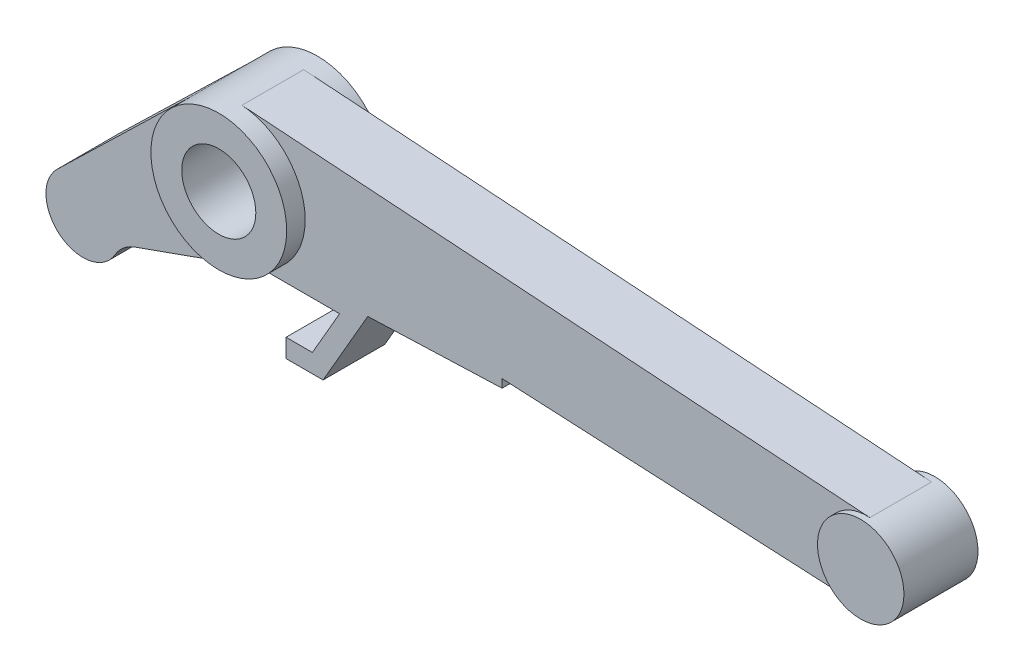
ISO-10303-21;
HEADER;
FILE_DESCRIPTION(('STEP AP214'),'2;1');
FILE_NAME('part.step','',(''),(''),'','','');
FILE_SCHEMA(('AUTOMOTIVE_DESIGN { 1 0 10303 214 1 1 1 1 }'));
ENDSEC;
DATA;
#1=APPLICATION_CONTEXT('core data for automotive mechanical design processes');
#2=APPLICATION_PROTOCOL_DEFINITION('international standard','automotive_design',2000,#1);
#3=PRODUCT_CONTEXT('',#1,'mechanical');
#4=PRODUCT('Part','Part','',(#3));
#5=PRODUCT_RELATED_PRODUCT_CATEGORY('part','',(#4));
#6=PRODUCT_DEFINITION_FORMATION('','',#4);
#7=PRODUCT_DEFINITION_CONTEXT('part definition',#1,'design');
#8=PRODUCT_DEFINITION('design','',#6,#7);
#9=PRODUCT_DEFINITION_SHAPE('','',#8);
#10=(LENGTH_UNIT() NAMED_UNIT(*) SI_UNIT(.MILLI.,.METRE.));
#11=(NAMED_UNIT(*) PLANE_ANGLE_UNIT() SI_UNIT($,.RADIAN.));
#12=(NAMED_UNIT(*) SI_UNIT($,.STERADIAN.) SOLID_ANGLE_UNIT());
#13=UNCERTAINTY_MEASURE_WITH_UNIT(LENGTH_MEASURE(1.E-05),#10,'distance_accuracy_value','');
#14=(GEOMETRIC_REPRESENTATION_CONTEXT(3) GLOBAL_UNCERTAINTY_ASSIGNED_CONTEXT((#13)) GLOBAL_UNIT_ASSIGNED_CONTEXT((#10,
#11,#12)) REPRESENTATION_CONTEXT('',''));
#15=CARTESIAN_POINT('',(0.,0.,0.));
#16=DIRECTION('',(0.,0.,1.));
#17=DIRECTION('',(1.,0.,0.));
#18=AXIS2_PLACEMENT_3D('',#15,#16,#17);
#19=CARTESIAN_POINT('',(0.,0.,8.));
#20=DIRECTION('',(0.,0.,1.));
#21=DIRECTION('',(1.,0.,0.));
#22=AXIS2_PLACEMENT_3D('',#19,#20,#21);
#23=PLANE('',#22);
#24=CARTESIAN_POINT('',(0.,0.,8.));
#25=DIRECTION('',(0.,0.,1.));
#26=DIRECTION('',(1.,0.,0.));
#27=AXIS2_PLACEMENT_3D('',#24,#25,#26);
#28=CIRCLE('',#27,11.);
#29=CARTESIAN_POINT('',(11.,0.,8.));
#30=VERTEX_POINT('',#29);
#31=EDGE_CURVE('E11',#30,#30,#28,.T.);
#32=ORIENTED_EDGE('',*,*,#31,.T.);
#33=EDGE_LOOP('',(#32));
#34=FACE_BOUND('',#33,.T.);
#35=CARTESIAN_POINT('',(0.,0.,8.));
#36=DIRECTION('',(0.,0.,1.));
#37=DIRECTION('',(1.,0.,0.));
#38=AXIS2_PLACEMENT_3D('',#35,#36,#37);
#39=CIRCLE('',#38,6.);
#40=CARTESIAN_POINT('',(6.,0.,8.));
#41=VERTEX_POINT('',#40);
#42=EDGE_CURVE('E256',#41,#41,#39,.T.);
#43=ORIENTED_EDGE('',*,*,#42,.F.);
#44=EDGE_LOOP('',(#43));
#45=FACE_BOUND('',#44,.T.);
#46=ADVANCED_FACE('F40',(#34,#45),#23,.T.);
#47=CARTESIAN_POINT('',(0.,0.,-8.));
#48=DIRECTION('',(0.,0.,1.));
#49=DIRECTION('',(1.,0.,0.));
#50=AXIS2_PLACEMENT_3D('',#47,#48,#49);
#51=PLANE('',#50);
#52=CARTESIAN_POINT('',(0.,0.,-8.));
#53=DIRECTION('',(0.,0.,1.));
#54=DIRECTION('',(1.,0.,0.));
#55=AXIS2_PLACEMENT_3D('',#52,#53,#54);
#56=CIRCLE('',#55,11.);
#57=CARTESIAN_POINT('',(11.,0.,-8.));
#58=VERTEX_POINT('',#57);
#59=EDGE_CURVE('E44',#58,#58,#56,.T.);
#60=ORIENTED_EDGE('',*,*,#59,.F.);
#61=EDGE_LOOP('',(#60));
#62=FACE_BOUND('',#61,.T.);
#63=CARTESIAN_POINT('',(0.,0.,-8.));
#64=DIRECTION('',(0.,0.,1.));
#65=DIRECTION('',(1.,0.,0.));
#66=AXIS2_PLACEMENT_3D('',#63,#64,#65);
#67=CIRCLE('',#66,6.);
#68=CARTESIAN_POINT('',(6.,0.,-8.));
#69=VERTEX_POINT('',#68);
#70=EDGE_CURVE('E259',#69,#69,#67,.T.);
#71=ORIENTED_EDGE('',*,*,#70,.T.);
#72=EDGE_LOOP('',(#71));
#73=FACE_BOUND('',#72,.T.);
#74=ADVANCED_FACE('F263',(#62,#73),#51,.F.);
#75=CARTESIAN_POINT('',(0.,0.,8.));
#76=DIRECTION('',(0.,0.,-1.));
#77=DIRECTION('',(-1.,0.,0.));
#78=AXIS2_PLACEMENT_3D('',#75,#76,#77);
#79=CYLINDRICAL_SURFACE('',#78,11.);
#80=CARTESIAN_POINT('',(0.,0.,5.));
#81=DIRECTION('',(0.,0.,1.));
#82=DIRECTION('',(1.,0.,0.));
#83=AXIS2_PLACEMENT_3D('',#80,#81,#82);
#84=CIRCLE('',#83,11.);
#85=CARTESIAN_POINT('',(3.69577035609868,-10.3605637624109,5.));
#86=VERTEX_POINT('',#85);
#87=CARTESIAN_POINT('',(0.754140733364815,10.974118267737,5.));
#88=VERTEX_POINT('',#87);
#89=EDGE_CURVE('E59',#86,#88,#84,.T.);
#90=ORIENTED_EDGE('',*,*,#89,.T.);
#91=DIRECTION('',(0.,0.,-1.));
#92=VECTOR('',#91,1.);
#93=CARTESIAN_POINT('',(0.754140733364814,10.974118267737,5.));
#94=LINE('',#93,#92);
#95=CARTESIAN_POINT('',(0.754140733364814,10.974118267737,-5.));
#96=VERTEX_POINT('',#95);
#97=EDGE_CURVE('E251',#88,#96,#94,.T.);
#98=ORIENTED_EDGE('',*,*,#97,.T.);
#99=CARTESIAN_POINT('',(0.,0.,-5.));
#100=DIRECTION('',(0.,0.,1.));
#101=DIRECTION('',(1.,0.,0.));
#102=AXIS2_PLACEMENT_3D('',#99,#100,#101);
#103=CIRCLE('',#102,11.);
#104=CARTESIAN_POINT('',(3.69577035609868,-10.3605637624109,-5.));
#105=VERTEX_POINT('',#104);
#106=EDGE_CURVE('E176',#105,#96,#103,.T.);
#107=ORIENTED_EDGE('',*,*,#106,.F.);
#108=CARTESIAN_POINT('',(-7.6555888425029,7.89885811206563,-5.));
#109=VERTEX_POINT('',#108);
#110=EDGE_CURVE('E254',#109,#105,#103,.T.);
#111=ORIENTED_EDGE('',*,*,#110,.F.);
#112=DIRECTION('',(0.,0.,-1.));
#113=VECTOR('',#112,1.);
#114=CARTESIAN_POINT('',(-7.6555888425029,7.89885811206563,5.));
#115=LINE('',#114,#113);
#116=CARTESIAN_POINT('',(-7.6555888425029,7.89885811206563,5.));
#117=VERTEX_POINT('',#116);
#118=EDGE_CURVE('E248',#117,#109,#115,.T.);
#119=ORIENTED_EDGE('',*,*,#118,.F.);
#120=EDGE_CURVE('E55',#117,#86,#84,.T.);
#121=ORIENTED_EDGE('',*,*,#120,.T.);
#122=EDGE_LOOP('',(#90,#98,#107,#111,#119,#121));
#123=FACE_BOUND('',#122,.T.);
#124=ORIENTED_EDGE('',*,*,#31,.F.);
#125=EDGE_LOOP('',(#124));
#126=FACE_BOUND('',#125,.T.);
#127=ORIENTED_EDGE('',*,*,#59,.T.);
#128=EDGE_LOOP('',(#127));
#129=FACE_BOUND('',#128,.T.);
#130=ADVANCED_FACE('F42',(#123,#126,#129),#79,.T.);
#131=CARTESIAN_POINT('',(0.,0.,8.));
#132=DIRECTION('',(0.,0.,-1.));
#133=DIRECTION('',(-1.,0.,0.));
#134=AXIS2_PLACEMENT_3D('',#131,#132,#133);
#135=CYLINDRICAL_SURFACE('',#134,6.);
#136=ORIENTED_EDGE('',*,*,#42,.T.);
#137=EDGE_LOOP('',(#136));
#138=FACE_BOUND('',#137,.T.);
#139=ORIENTED_EDGE('',*,*,#70,.F.);
#140=EDGE_LOOP('',(#139));
#141=FACE_BOUND('',#140,.T.);
#142=ADVANCED_FACE('F265',(#138,#141),#135,.F.);
#143=CARTESIAN_POINT('',(0.,0.,5.));
#144=DIRECTION('',(0.,0.,1.));
#145=DIRECTION('',(1.,0.,0.));
#146=AXIS2_PLACEMENT_3D('',#143,#144,#145);
#147=PLANE('',#146);
#148=ORIENTED_EDGE('',*,*,#120,.F.);
#149=DIRECTION('',(-0.718078010187785,-0.695962622045718,0.));
#150=VECTOR('',#149,1.);
#151=CARTESIAN_POINT('',(-7.6555888425029,7.89885811206563,5.));
#152=LINE('',#151,#150);
#153=CARTESIAN_POINT('',(-29.1757757322743,-12.9585494150114,5.));
#154=VERTEX_POINT('',#153);
#155=EDGE_CURVE('E513',#117,#154,#152,.T.);
#156=ORIENTED_EDGE('',*,*,#155,.T.);
#157=CARTESIAN_POINT('',(-25.,-17.2670174761381,5.));
#158=DIRECTION('',(0.,0.,1.));
#159=DIRECTION('',(1.,0.,0.));
#160=AXIS2_PLACEMENT_3D('',#157,#158,#159);
#161=CIRCLE('',#160,6.);
#162=CARTESIAN_POINT('',(-19.8012986185166,-20.2625982121829,5.));
#163=VERTEX_POINT('',#162);
#164=EDGE_CURVE('E515',#154,#163,#161,.T.);
#165=ORIENTED_EDGE('',*,*,#164,.T.);
#166=CARTESIAN_POINT('',(-14.6025972370332,-23.2581789482276,5.));
#167=DIRECTION('',(0.,0.,1.));
#168=DIRECTION('',(1.,0.,0.));
#169=AXIS2_PLACEMENT_3D('',#166,#167,#168);
#170=CIRCLE('',#169,6.);
#171=CARTESIAN_POINT('',(-16.6184719767234,-17.606962350549,5.));
#172=VERTEX_POINT('',#171);
#173=EDGE_CURVE('E517',#163,#172,#170,.F.);
#174=ORIENTED_EDGE('',*,*,#173,.T.);
#175=DIRECTION('',(0.941869432946447,0.335979123281698,0.));
#176=VECTOR('',#175,1.);
#177=CARTESIAN_POINT('',(3.69577035609868,-10.3605637624109,5.));
#178=LINE('',#177,#176);
#179=EDGE_CURVE('E519',#172,#86,#178,.T.);
#180=ORIENTED_EDGE('',*,*,#179,.T.);
#181=EDGE_LOOP('',(#148,#156,#165,#174,#180));
#182=FACE_BOUND('',#181,.T.);
#183=ADVANCED_FACE('F267',(#182),#147,.T.);
#184=CARTESIAN_POINT('',(0.,0.,-5.));
#185=DIRECTION('',(0.,0.,1.));
#186=DIRECTION('',(1.,0.,0.));
#187=AXIS2_PLACEMENT_3D('',#184,#185,#186);
#188=PLANE('',#187);
#189=DIRECTION('',(-0.718078010187785,-0.695962622045718,0.));
#190=VECTOR('',#189,1.);
#191=CARTESIAN_POINT('',(-7.6555888425029,7.89885811206563,-5.));
#192=LINE('',#191,#190);
#193=CARTESIAN_POINT('',(-29.1757757322743,-12.9585494150114,-5.));
#194=VERTEX_POINT('',#193);
#195=EDGE_CURVE('E177',#109,#194,#192,.T.);
#196=ORIENTED_EDGE('',*,*,#195,.F.);
#197=ORIENTED_EDGE('',*,*,#110,.T.);
#198=DIRECTION('',(0.941869432946447,0.335979123281698,0.));
#199=VECTOR('',#198,1.);
#200=CARTESIAN_POINT('',(3.69577035609868,-10.3605637624109,-5.));
#201=LINE('',#200,#199);
#202=CARTESIAN_POINT('',(-16.6184719767234,-17.606962350549,-5.));
#203=VERTEX_POINT('',#202);
#204=EDGE_CURVE('E191',#203,#105,#201,.T.);
#205=ORIENTED_EDGE('',*,*,#204,.F.);
#206=CARTESIAN_POINT('',(-14.6025972370332,-23.2581789482276,-5.));
#207=DIRECTION('',(0.,0.,1.));
#208=DIRECTION('',(1.,0.,0.));
#209=AXIS2_PLACEMENT_3D('',#206,#207,#208);
#210=CIRCLE('',#209,6.);
#211=CARTESIAN_POINT('',(-19.8012986185166,-20.2625982121829,-5.));
#212=VERTEX_POINT('',#211);
#213=EDGE_CURVE('E189',#212,#203,#210,.F.);
#214=ORIENTED_EDGE('',*,*,#213,.F.);
#215=CARTESIAN_POINT('',(-25.,-17.2670174761381,-5.));
#216=DIRECTION('',(0.,0.,1.));
#217=DIRECTION('',(1.,0.,0.));
#218=AXIS2_PLACEMENT_3D('',#215,#216,#217);
#219=CIRCLE('',#218,6.);
#220=EDGE_CURVE('E180',#194,#212,#219,.T.);
#221=ORIENTED_EDGE('',*,*,#220,.F.);
#222=EDGE_LOOP('',(#196,#197,#205,#214,#221));
#223=FACE_BOUND('',#222,.T.);
#224=ADVANCED_FACE('F274',(#223),#188,.F.);
#225=CARTESIAN_POINT('',(0.754140733364815,10.974118267737,5.));
#226=DIRECTION('',(-0.0685582484877104,-0.997647115248823,0.));
#227=DIRECTION('',(0.997647115248823,-0.0685582484877104,0.));
#228=AXIS2_PLACEMENT_3D('',#225,#226,#227);
#229=PLANE('',#228);
#230=DIRECTION('',(-0.997647115248823,0.0685582484877104,0.));
#231=VECTOR('',#230,1.);
#232=CARTESIAN_POINT('',(0.754140733364815,10.974118267737,-5.));
#233=LINE('',#232,#231);
#234=CARTESIAN_POINT('',(102.479907739414,3.98352980674176,-5.));
#235=VERTEX_POINT('',#234);
#236=EDGE_CURVE('E169',#235,#96,#233,.T.);
#237=ORIENTED_EDGE('',*,*,#236,.T.);
#238=ORIENTED_EDGE('',*,*,#97,.F.);
#239=DIRECTION('',(-0.997647115248823,0.0685582484877104,0.));
#240=VECTOR('',#239,1.);
#241=CARTESIAN_POINT('',(0.754140733364815,10.974118267737,5.));
#242=LINE('',#241,#240);
#243=CARTESIAN_POINT('',(102.479907739414,3.98352980674176,5.));
#244=VERTEX_POINT('',#243);
#245=EDGE_CURVE('E162',#244,#88,#242,.T.);
#246=ORIENTED_EDGE('',*,*,#245,.F.);
#247=DIRECTION('',(0.,0.,-1.));
#248=VECTOR('',#247,1.);
#249=CARTESIAN_POINT('',(102.479907739414,3.98352980674176,5.));
#250=LINE('',#249,#248);
#251=EDGE_CURVE('E154',#244,#235,#250,.T.);
#252=ORIENTED_EDGE('',*,*,#251,.T.);
#253=EDGE_LOOP('',(#237,#238,#246,#252));
#254=FACE_BOUND('',#253,.T.);
#255=ADVANCED_FACE('F167',(#254),#229,.F.);
#256=CARTESIAN_POINT('',(-7.6555888425029,7.89885811206563,5.));
#257=DIRECTION('',(0.695962622045718,-0.718078010187785,0.));
#258=DIRECTION('',(0.718078010187785,0.695962622045718,0.));
#259=AXIS2_PLACEMENT_3D('',#256,#257,#258);
#260=PLANE('',#259);
#261=ORIENTED_EDGE('',*,*,#195,.T.);
#262=DIRECTION('',(0.,0.,-1.));
#263=VECTOR('',#262,1.);
#264=CARTESIAN_POINT('',(-29.1757757322743,-12.9585494150114,5.));
#265=LINE('',#264,#263);
#266=EDGE_CURVE('E245',#154,#194,#265,.T.);
#267=ORIENTED_EDGE('',*,*,#266,.F.);
#268=ORIENTED_EDGE('',*,*,#155,.F.);
#269=ORIENTED_EDGE('',*,*,#118,.T.);
#270=EDGE_LOOP('',(#261,#267,#268,#269));
#271=FACE_BOUND('',#270,.T.);
#272=ADVANCED_FACE('F326',(#271),#260,.F.);
#273=CARTESIAN_POINT('',(-25.,-17.2670174761381,5.));
#274=DIRECTION('',(0.,0.,-1.));
#275=DIRECTION('',(-1.,0.,0.));
#276=AXIS2_PLACEMENT_3D('',#273,#274,#275);
#277=CYLINDRICAL_SURFACE('',#276,6.);
#278=ORIENTED_EDGE('',*,*,#220,.T.);
#279=DIRECTION('',(0.,0.,-1.));
#280=VECTOR('',#279,1.);
#281=CARTESIAN_POINT('',(-19.8012986185166,-20.2625982121829,5.));
#282=LINE('',#281,#280);
#283=EDGE_CURVE('E242',#163,#212,#282,.T.);
#284=ORIENTED_EDGE('',*,*,#283,.F.);
#285=ORIENTED_EDGE('',*,*,#164,.F.);
#286=ORIENTED_EDGE('',*,*,#266,.T.);
#287=EDGE_LOOP('',(#278,#284,#285,#286));
#288=FACE_BOUND('',#287,.T.);
#289=ADVANCED_FACE('F335',(#288),#277,.T.);
#290=CARTESIAN_POINT('',(-14.6025972370332,-23.2581789482276,5.));
#291=DIRECTION('',(0.,0.,-1.));
#292=DIRECTION('',(-1.,0.,0.));
#293=AXIS2_PLACEMENT_3D('',#290,#291,#292);
#294=CYLINDRICAL_SURFACE('',#293,6.);
#295=ORIENTED_EDGE('',*,*,#213,.T.);
#296=DIRECTION('',(0.,0.,-1.));
#297=VECTOR('',#296,1.);
#298=CARTESIAN_POINT('',(-16.6184719767234,-17.606962350549,5.));
#299=LINE('',#298,#297);
#300=EDGE_CURVE('E239',#172,#203,#299,.T.);
#301=ORIENTED_EDGE('',*,*,#300,.F.);
#302=ORIENTED_EDGE('',*,*,#173,.F.);
#303=ORIENTED_EDGE('',*,*,#283,.T.);
#304=EDGE_LOOP('',(#295,#301,#302,#303));
#305=FACE_BOUND('',#304,.T.);
#306=ADVANCED_FACE('F345',(#305),#294,.F.);
#307=CARTESIAN_POINT('',(3.69577035609868,-10.3605637624109,5.));
#308=DIRECTION('',(-0.335979123281698,0.941869432946447,0.));
#309=DIRECTION('',(-0.941869432946447,-0.335979123281698,0.));
#310=AXIS2_PLACEMENT_3D('',#307,#308,#309);
#311=PLANE('',#310);
#312=ORIENTED_EDGE('',*,*,#204,.T.);
#313=DIRECTION('',(0.,0.,-1.));
#314=VECTOR('',#313,1.);
#315=CARTESIAN_POINT('',(3.69577035609868,-10.3605637624109,5.));
#316=LINE('',#315,#314);
#317=EDGE_CURVE('E236',#86,#105,#316,.T.);
#318=ORIENTED_EDGE('',*,*,#317,.F.);
#319=ORIENTED_EDGE('',*,*,#179,.F.);
#320=ORIENTED_EDGE('',*,*,#300,.T.);
#321=EDGE_LOOP('',(#312,#318,#319,#320));
#322=FACE_BOUND('',#321,.T.);
#323=ADVANCED_FACE('F355',(#322),#311,.F.);
#324=CARTESIAN_POINT('',(0.,-10.3605637624109,5.));
#325=DIRECTION('',(0.,1.,0.));
#326=DIRECTION('',(0.,0.,1.));
#327=AXIS2_PLACEMENT_3D('',#324,#325,#326);
#328=PLANE('',#327);
#329=DIRECTION('',(1.,0.,0.));
#330=VECTOR('',#329,1.);
#331=CARTESIAN_POINT('',(0.,-10.3605637624109,-5.));
#332=LINE('',#331,#330);
#333=CARTESIAN_POINT('',(16.5765926039787,-10.3605637624109,-5.));
#334=VERTEX_POINT('',#333);
#335=EDGE_CURVE('E194',#105,#334,#332,.T.);
#336=ORIENTED_EDGE('',*,*,#335,.T.);
#337=DIRECTION('',(0.,0.,-1.));
#338=VECTOR('',#337,1.);
#339=CARTESIAN_POINT('',(16.5765926039787,-10.3605637624109,5.));
#340=LINE('',#339,#338);
#341=CARTESIAN_POINT('',(16.5765926039787,-10.3605637624109,5.));
#342=VERTEX_POINT('',#341);
#343=EDGE_CURVE('E233',#342,#334,#340,.T.);
#344=ORIENTED_EDGE('',*,*,#343,.F.);
#345=DIRECTION('',(1.,0.,0.));
#346=VECTOR('',#345,1.);
#347=CARTESIAN_POINT('',(0.,-10.3605637624109,5.));
#348=LINE('',#347,#346);
#349=EDGE_CURVE('E522',#86,#342,#348,.T.);
#350=ORIENTED_EDGE('',*,*,#349,.F.);
#351=ORIENTED_EDGE('',*,*,#317,.T.);
#352=EDGE_LOOP('',(#336,#344,#350,#351));
#353=FACE_BOUND('',#352,.T.);
#354=ADVANCED_FACE('F365',(#353),#328,.F.);
#355=CARTESIAN_POINT('',(16.9187001608722,-9.76801609221812,5.));
#356=DIRECTION('',(0.866025403784439,-0.5,0.));
#357=DIRECTION('',(0.5,0.866025403784439,0.));
#358=AXIS2_PLACEMENT_3D('',#355,#356,#357);
#359=PLANE('',#358);
#360=DIRECTION('',(-0.5,-0.866025403784439,0.));
#361=VECTOR('',#360,1.);
#362=CARTESIAN_POINT('',(16.9187001608722,-9.76801609221812,-5.));
#363=LINE('',#362,#361);
#364=CARTESIAN_POINT('',(12.1659620357497,-18.,-5.));
#365=VERTEX_POINT('',#364);
#366=EDGE_CURVE('E196',#334,#365,#363,.T.);
#367=ORIENTED_EDGE('',*,*,#366,.T.);
#368=DIRECTION('',(0.,0.,-1.));
#369=VECTOR('',#368,1.);
#370=CARTESIAN_POINT('',(12.1659620357497,-18.,5.));
#371=LINE('',#370,#369);
#372=CARTESIAN_POINT('',(12.1659620357497,-18.,5.));
#373=VERTEX_POINT('',#372);
#374=EDGE_CURVE('E230',#373,#365,#371,.T.);
#375=ORIENTED_EDGE('',*,*,#374,.F.);
#376=DIRECTION('',(-0.5,-0.866025403784439,0.));
#377=VECTOR('',#376,1.);
#378=CARTESIAN_POINT('',(16.9187001608722,-9.76801609221812,5.));
#379=LINE('',#378,#377);
#380=EDGE_CURVE('E524',#342,#373,#379,.T.);
#381=ORIENTED_EDGE('',*,*,#380,.F.);
#382=ORIENTED_EDGE('',*,*,#343,.T.);
#383=EDGE_LOOP('',(#367,#375,#381,#382));
#384=FACE_BOUND('',#383,.T.);
#385=ADVANCED_FACE('F375',(#384),#359,.F.);
#386=CARTESIAN_POINT('',(0.,-18.,5.));
#387=DIRECTION('',(0.,-1.,0.));
#388=DIRECTION('',(0.,0.,-1.));
#389=AXIS2_PLACEMENT_3D('',#386,#387,#388);
#390=PLANE('',#389);
#391=DIRECTION('',(-1.,0.,0.));
#392=VECTOR('',#391,1.);
#393=CARTESIAN_POINT('',(0.,-18.,-5.));
#394=LINE('',#393,#392);
#395=CARTESIAN_POINT('',(7.89801284331855,-18.,-5.));
#396=VERTEX_POINT('',#395);
#397=EDGE_CURVE('E198',#365,#396,#394,.T.);
#398=ORIENTED_EDGE('',*,*,#397,.T.);
#399=DIRECTION('',(0.,0.,-1.));
#400=VECTOR('',#399,1.);
#401=CARTESIAN_POINT('',(7.89801284331855,-18.,5.));
#402=LINE('',#401,#400);
#403=CARTESIAN_POINT('',(7.89801284331855,-18.,5.));
#404=VERTEX_POINT('',#403);
#405=EDGE_CURVE('E227',#404,#396,#402,.T.);
#406=ORIENTED_EDGE('',*,*,#405,.F.);
#407=DIRECTION('',(-1.,0.,0.));
#408=VECTOR('',#407,1.);
#409=CARTESIAN_POINT('',(0.,-18.,5.));
#410=LINE('',#409,#408);
#411=EDGE_CURVE('E526',#373,#404,#410,.T.);
#412=ORIENTED_EDGE('',*,*,#411,.F.);
#413=ORIENTED_EDGE('',*,*,#374,.T.);
#414=EDGE_LOOP('',(#398,#406,#412,#413));
#415=FACE_BOUND('',#414,.T.);
#416=ADVANCED_FACE('F385',(#415),#390,.F.);
#417=CARTESIAN_POINT('',(7.89801284331855,0.,5.));
#418=DIRECTION('',(1.,0.,0.));
#419=DIRECTION('',(0.,0.,-1.));
#420=AXIS2_PLACEMENT_3D('',#417,#418,#419);
#421=PLANE('',#420);
#422=DIRECTION('',(0.,-1.,0.));
#423=VECTOR('',#422,1.);
#424=CARTESIAN_POINT('',(7.89801284331855,0.,-5.));
#425=LINE('',#424,#423);
#426=CARTESIAN_POINT('',(7.89801284331855,-21.,-5.));
#427=VERTEX_POINT('',#426);
#428=EDGE_CURVE('E200',#396,#427,#425,.T.);
#429=ORIENTED_EDGE('',*,*,#428,.T.);
#430=DIRECTION('',(0.,0.,-1.));
#431=VECTOR('',#430,1.);
#432=CARTESIAN_POINT('',(7.89801284331855,-21.,5.));
#433=LINE('',#432,#431);
#434=CARTESIAN_POINT('',(7.89801284331855,-21.,5.));
#435=VERTEX_POINT('',#434);
#436=EDGE_CURVE('E224',#435,#427,#433,.T.);
#437=ORIENTED_EDGE('',*,*,#436,.F.);
#438=DIRECTION('',(0.,-1.,0.));
#439=VECTOR('',#438,1.);
#440=CARTESIAN_POINT('',(7.89801284331855,0.,5.));
#441=LINE('',#440,#439);
#442=EDGE_CURVE('E528',#404,#435,#441,.T.);
#443=ORIENTED_EDGE('',*,*,#442,.F.);
#444=ORIENTED_EDGE('',*,*,#405,.T.);
#445=EDGE_LOOP('',(#429,#437,#443,#444));
#446=FACE_BOUND('',#445,.T.);
#447=ADVANCED_FACE('F395',(#446),#421,.F.);
#448=CARTESIAN_POINT('',(0.,-21.,5.));
#449=DIRECTION('',(0.,1.,0.));
#450=DIRECTION('',(-1.,0.,0.));
#451=AXIS2_PLACEMENT_3D('',#448,#449,#450);
#452=PLANE('',#451);
#453=DIRECTION('',(1.,0.,0.));
#454=VECTOR('',#453,1.);
#455=CARTESIAN_POINT('',(0.,-21.,-5.));
#456=LINE('',#455,#454);
#457=CARTESIAN_POINT('',(13.8980128433185,-21.,-5.));
#458=VERTEX_POINT('',#457);
#459=EDGE_CURVE('E202',#427,#458,#456,.T.);
#460=ORIENTED_EDGE('',*,*,#459,.T.);
#461=DIRECTION('',(0.,0.,-1.));
#462=VECTOR('',#461,1.);
#463=CARTESIAN_POINT('',(13.8980128433185,-21.,5.));
#464=LINE('',#463,#462);
#465=CARTESIAN_POINT('',(13.8980128433185,-21.,5.));
#466=VERTEX_POINT('',#465);
#467=EDGE_CURVE('E221',#466,#458,#464,.T.);
#468=ORIENTED_EDGE('',*,*,#467,.F.);
#469=DIRECTION('',(1.,0.,0.));
#470=VECTOR('',#469,1.);
#471=CARTESIAN_POINT('',(0.,-21.,5.));
#472=LINE('',#471,#470);
#473=EDGE_CURVE('E530',#435,#466,#472,.T.);
#474=ORIENTED_EDGE('',*,*,#473,.F.);
#475=ORIENTED_EDGE('',*,*,#436,.T.);
#476=EDGE_LOOP('',(#460,#468,#474,#475));
#477=FACE_BOUND('',#476,.T.);
#478=ADVANCED_FACE('F405',(#477),#452,.F.);
#479=CARTESIAN_POINT('',(19.5167763722255,-11.2680160922181,5.));
#480=DIRECTION('',(-0.866025403784439,0.5,0.));
#481=DIRECTION('',(-0.5,-0.866025403784439,0.));
#482=AXIS2_PLACEMENT_3D('',#479,#480,#481);
#483=PLANE('',#482);
#484=DIRECTION('',(0.5,0.866025403784439,0.));
#485=VECTOR('',#484,1.);
#486=CARTESIAN_POINT('',(19.5167763722255,-11.2680160922181,-5.));
#487=LINE('',#486,#485);
#488=CARTESIAN_POINT('',(21.1381580234829,-8.45970069378034,-5.));
#489=VERTEX_POINT('',#488);
#490=EDGE_CURVE('E204',#458,#489,#487,.T.);
#491=ORIENTED_EDGE('',*,*,#490,.T.);
#492=DIRECTION('',(0.,0.,-1.));
#493=VECTOR('',#492,1.);
#494=CARTESIAN_POINT('',(21.1381580234829,-8.45970069378034,5.));
#495=LINE('',#494,#493);
#496=CARTESIAN_POINT('',(21.1381580234829,-8.45970069378034,5.));
#497=VERTEX_POINT('',#496);
#498=EDGE_CURVE('E218',#497,#489,#495,.T.);
#499=ORIENTED_EDGE('',*,*,#498,.F.);
#500=DIRECTION('',(0.5,0.866025403784439,0.));
#501=VECTOR('',#500,1.);
#502=CARTESIAN_POINT('',(19.5167763722255,-11.2680160922181,5.));
#503=LINE('',#502,#501);
#504=EDGE_CURVE('E532',#466,#497,#503,.T.);
#505=ORIENTED_EDGE('',*,*,#504,.F.);
#506=ORIENTED_EDGE('',*,*,#467,.T.);
#507=EDGE_LOOP('',(#491,#499,#505,#506));
#508=FACE_BOUND('',#507,.T.);
#509=ADVANCED_FACE('F415',(#508),#483,.F.);
#510=CARTESIAN_POINT('',(0.34271613392866,-9.23170674275091,5.));
#511=DIRECTION('',(-0.037098255554971,0.999311622785794,0.));
#512=DIRECTION('',(-0.999311622785795,-0.037098255554971,0.));
#513=AXIS2_PLACEMENT_3D('',#510,#511,#512);
#514=PLANE('',#513);
#515=DIRECTION('',(0.999311622785795,0.0370982555549711,0.));
#516=VECTOR('',#515,1.);
#517=CARTESIAN_POINT('',(0.34271613392866,-9.23170674275091,-5.));
#518=LINE('',#517,#516);
#519=CARTESIAN_POINT('',(42.8980128433186,-7.65189196171042,-5.));
#520=VERTEX_POINT('',#519);
#521=EDGE_CURVE('E206',#489,#520,#518,.T.);
#522=ORIENTED_EDGE('',*,*,#521,.T.);
#523=DIRECTION('',(0.,0.,-1.));
#524=VECTOR('',#523,1.);
#525=CARTESIAN_POINT('',(42.8980128433186,-7.65189196171042,5.));
#526=LINE('',#525,#524);
#527=CARTESIAN_POINT('',(42.8980128433186,-7.65189196171042,5.));
#528=VERTEX_POINT('',#527);
#529=EDGE_CURVE('E215',#528,#520,#526,.T.);
#530=ORIENTED_EDGE('',*,*,#529,.F.);
#531=DIRECTION('',(0.999311622785795,0.0370982555549711,0.));
#532=VECTOR('',#531,1.);
#533=CARTESIAN_POINT('',(0.34271613392866,-9.23170674275091,5.));
#534=LINE('',#533,#532);
#535=EDGE_CURVE('E534',#497,#528,#534,.T.);
#536=ORIENTED_EDGE('',*,*,#535,.F.);
#537=ORIENTED_EDGE('',*,*,#498,.T.);
#538=EDGE_LOOP('',(#522,#530,#536,#537));
#539=FACE_BOUND('',#538,.T.);
#540=ADVANCED_FACE('F425',(#539),#514,.F.);
#541=CARTESIAN_POINT('',(42.8980128433186,0.,5.));
#542=DIRECTION('',(-1.,0.,0.));
#543=DIRECTION('',(0.,0.,1.));
#544=AXIS2_PLACEMENT_3D('',#541,#542,#543);
#545=PLANE('',#544);
#546=DIRECTION('',(0.,1.,0.));
#547=VECTOR('',#546,1.);
#548=CARTESIAN_POINT('',(42.8980128433186,0.,-5.));
#549=LINE('',#548,#547);
#550=CARTESIAN_POINT('',(42.8980128433186,-6.30294911333386,-5.));
#551=VERTEX_POINT('',#550);
#552=EDGE_CURVE('E208',#520,#551,#549,.T.);
#553=ORIENTED_EDGE('',*,*,#552,.T.);
#554=DIRECTION('',(0.,0.,-1.));
#555=VECTOR('',#554,1.);
#556=CARTESIAN_POINT('',(42.8980128433186,-6.30294911333386,5.));
#557=LINE('',#556,#555);
#558=CARTESIAN_POINT('',(42.8980128433186,-6.30294911333386,5.));
#559=VERTEX_POINT('',#558);
#560=EDGE_CURVE('E212',#559,#551,#557,.T.);
#561=ORIENTED_EDGE('',*,*,#560,.F.);
#562=DIRECTION('',(0.,1.,0.));
#563=VECTOR('',#562,1.);
#564=CARTESIAN_POINT('',(42.8980128433186,0.,5.));
#565=LINE('',#564,#563);
#566=EDGE_CURVE('E536',#528,#559,#565,.T.);
#567=ORIENTED_EDGE('',*,*,#566,.F.);
#568=ORIENTED_EDGE('',*,*,#529,.T.);
#569=EDGE_LOOP('',(#553,#561,#567,#568));
#570=FACE_BOUND('',#569,.T.);
#571=ADVANCED_FACE('F435',(#570),#545,.F.);
#572=CARTESIAN_POINT('',(-0.206631875868075,-4.16389654594144,5.));
#573=DIRECTION('',(0.0495636517829857,0.998770966949848,0.));
#574=DIRECTION('',(-0.998770966949848,0.0495636517829857,0.));
#575=AXIS2_PLACEMENT_3D('',#572,#573,#574);
#576=PLANE('',#575);
#577=DIRECTION('',(0.998770966949848,-0.0495636517829857,0.));
#578=VECTOR('',#577,1.);
#579=CARTESIAN_POINT('',(-0.206631875868075,-4.16389654594144,-5.));
#580=LINE('',#579,#578);
#581=CARTESIAN_POINT('',(98.5,-9.06217782649105,-5.));
#582=VERTEX_POINT('',#581);
#583=EDGE_CURVE('E163',#551,#582,#580,.T.);
#584=ORIENTED_EDGE('',*,*,#583,.T.);
#585=DIRECTION('',(0.,0.,-1.));
#586=VECTOR('',#585,1.);
#587=CARTESIAN_POINT('',(98.5,-9.06217782649105,5.));
#588=LINE('',#587,#586);
#589=CARTESIAN_POINT('',(98.5,-9.06217782649105,5.));
#590=VERTEX_POINT('',#589);
#591=EDGE_CURVE('E157',#590,#582,#588,.T.);
#592=ORIENTED_EDGE('',*,*,#591,.F.);
#593=DIRECTION('',(0.998770966949848,-0.0495636517829857,0.));
#594=VECTOR('',#593,1.);
#595=CARTESIAN_POINT('',(-0.206631875868075,-4.16389654594144,5.));
#596=LINE('',#595,#594);
#597=EDGE_CURVE('E537',#559,#590,#596,.T.);
#598=ORIENTED_EDGE('',*,*,#597,.F.);
#599=ORIENTED_EDGE('',*,*,#560,.T.);
#600=EDGE_LOOP('',(#584,#592,#598,#599));
#601=FACE_BOUND('',#600,.T.);
#602=ADVANCED_FACE('F445',(#601),#576,.F.);
#603=ORIENTED_EDGE('',*,*,#89,.F.);
#604=ORIENTED_EDGE('',*,*,#349,.T.);
#605=ORIENTED_EDGE('',*,*,#380,.T.);
#606=ORIENTED_EDGE('',*,*,#411,.T.);
#607=ORIENTED_EDGE('',*,*,#442,.T.);
#608=ORIENTED_EDGE('',*,*,#473,.T.);
#609=ORIENTED_EDGE('',*,*,#504,.T.);
#610=ORIENTED_EDGE('',*,*,#535,.T.);
#611=ORIENTED_EDGE('',*,*,#566,.T.);
#612=ORIENTED_EDGE('',*,*,#597,.T.);
#613=CARTESIAN_POINT('',(102.,-3.,5.));
#614=DIRECTION('',(0.,0.,1.));
#615=DIRECTION('',(1.,0.,0.));
#616=AXIS2_PLACEMENT_3D('',#613,#614,#615);
#617=CIRCLE('',#616,7.);
#618=EDGE_CURVE('E171',#244,#590,#617,.T.);
#619=ORIENTED_EDGE('',*,*,#618,.F.);
#620=ORIENTED_EDGE('',*,*,#245,.T.);
#621=EDGE_LOOP('',(#603,#604,#605,#606,#607,#608,#609,#610,#611,#612,#619,#620));
#622=FACE_BOUND('',#621,.T.);
#623=ADVANCED_FACE('F277',(#622),#147,.T.);
#624=ORIENTED_EDGE('',*,*,#335,.F.);
#625=ORIENTED_EDGE('',*,*,#106,.T.);
#626=ORIENTED_EDGE('',*,*,#236,.F.);
#627=CARTESIAN_POINT('',(102.,-3.,-5.));
#628=DIRECTION('',(0.,0.,1.));
#629=DIRECTION('',(1.,0.,0.));
#630=AXIS2_PLACEMENT_3D('',#627,#628,#629);
#631=CIRCLE('',#630,7.);
#632=EDGE_CURVE('E150',#235,#582,#631,.T.);
#633=ORIENTED_EDGE('',*,*,#632,.T.);
#634=ORIENTED_EDGE('',*,*,#583,.F.);
#635=ORIENTED_EDGE('',*,*,#552,.F.);
#636=ORIENTED_EDGE('',*,*,#521,.F.);
#637=ORIENTED_EDGE('',*,*,#490,.F.);
#638=ORIENTED_EDGE('',*,*,#459,.F.);
#639=ORIENTED_EDGE('',*,*,#428,.F.);
#640=ORIENTED_EDGE('',*,*,#397,.F.);
#641=ORIENTED_EDGE('',*,*,#366,.F.);
#642=EDGE_LOOP('',(#624,#625,#626,#633,#634,#635,#636,#637,#638,#639,#640,#641));
#643=FACE_BOUND('',#642,.T.);
#644=ADVANCED_FACE('F175',(#643),#188,.F.);
#645=CARTESIAN_POINT('',(102.,-3.,6.));
#646=DIRECTION('',(0.,0.,-1.));
#647=DIRECTION('',(-1.,0.,0.));
#648=AXIS2_PLACEMENT_3D('',#645,#646,#647);
#649=CYLINDRICAL_SURFACE('',#648,7.);
#650=ORIENTED_EDGE('',*,*,#618,.T.);
#651=ORIENTED_EDGE('',*,*,#591,.T.);
#652=ORIENTED_EDGE('',*,*,#632,.F.);
#653=ORIENTED_EDGE('',*,*,#251,.F.);
#654=EDGE_LOOP('',(#650,#651,#652,#653));
#655=FACE_BOUND('',#654,.T.);
#656=CARTESIAN_POINT('',(102.,-3.,6.));
#657=DIRECTION('',(0.,0.,1.));
#658=DIRECTION('',(1.,0.,0.));
#659=AXIS2_PLACEMENT_3D('',#656,#657,#658);
#660=CIRCLE('',#659,7.);
#661=CARTESIAN_POINT('',(109.,-3.,6.));
#662=VERTEX_POINT('',#661);
#663=EDGE_CURVE('E178',#662,#662,#660,.T.);
#664=ORIENTED_EDGE('',*,*,#663,.F.);
#665=EDGE_LOOP('',(#664));
#666=FACE_BOUND('',#665,.T.);
#667=CARTESIAN_POINT('',(102.,-3.,-6.));
#668=DIRECTION('',(0.,0.,1.));
#669=DIRECTION('',(1.,0.,0.));
#670=AXIS2_PLACEMENT_3D('',#667,#668,#669);
#671=CIRCLE('',#670,7.);
#672=CARTESIAN_POINT('',(109.,-3.,-6.));
#673=VERTEX_POINT('',#672);
#674=EDGE_CURVE('E183',#673,#673,#671,.T.);
#675=ORIENTED_EDGE('',*,*,#674,.T.);
#676=EDGE_LOOP('',(#675));
#677=FACE_BOUND('',#676,.T.);
#678=ADVANCED_FACE('F152',(#655,#666,#677),#649,.T.);
#679=CARTESIAN_POINT('',(0.,0.,6.));
#680=DIRECTION('',(0.,0.,1.));
#681=DIRECTION('',(1.,0.,0.));
#682=AXIS2_PLACEMENT_3D('',#679,#680,#681);
#683=PLANE('',#682);
#684=ORIENTED_EDGE('',*,*,#663,.T.);
#685=EDGE_LOOP('',(#684));
#686=FACE_BOUND('',#685,.T.);
#687=ADVANCED_FACE('F480',(#686),#683,.T.);
#688=CARTESIAN_POINT('',(0.,0.,-6.));
#689=DIRECTION('',(0.,0.,1.));
#690=DIRECTION('',(1.,0.,0.));
#691=AXIS2_PLACEMENT_3D('',#688,#689,#690);
#692=PLANE('',#691);
#693=ORIENTED_EDGE('',*,*,#674,.F.);
#694=EDGE_LOOP('',(#693));
#695=FACE_BOUND('',#694,.T.);
#696=ADVANCED_FACE('F489',(#695),#692,.F.);
#697=CLOSED_SHELL('',(#46,#74,#130,#142,#183,#224,#255,#272,#289,#306,#323,#354,#385,#416,#447,
#478,#509,#540,#571,#602,#623,#644,#678,#687,#696));
#698=MANIFOLD_SOLID_BREP('B2',#697);
#699=ADVANCED_BREP_SHAPE_REPRESENTATION('',(#18,#698),#14);
#700=SHAPE_DEFINITION_REPRESENTATION(#9,#699);
ENDSEC;
END-ISO-10303-21;
